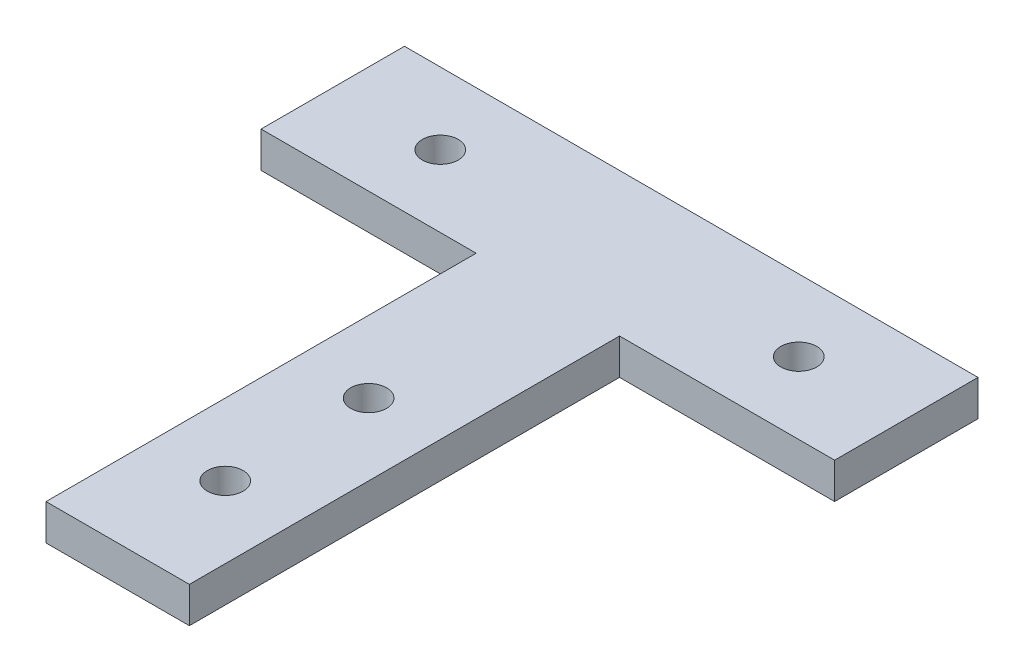
ISO-10303-21;
HEADER;
FILE_DESCRIPTION(('STEP AP214'),'2;1');
FILE_NAME('part.step','',(''),(''),'','','');
FILE_SCHEMA(('AUTOMOTIVE_DESIGN { 1 0 10303 214 1 1 1 1 }'));
ENDSEC;
DATA;
#1=APPLICATION_CONTEXT('core data for automotive mechanical design processes');
#2=APPLICATION_PROTOCOL_DEFINITION('international standard','automotive_design',2000,#1);
#3=PRODUCT_CONTEXT('',#1,'mechanical');
#4=PRODUCT('Part','Part','',(#3));
#5=PRODUCT_RELATED_PRODUCT_CATEGORY('part','',(#4));
#6=PRODUCT_DEFINITION_FORMATION('','',#4);
#7=PRODUCT_DEFINITION_CONTEXT('part definition',#1,'design');
#8=PRODUCT_DEFINITION('design','',#6,#7);
#9=PRODUCT_DEFINITION_SHAPE('','',#8);
#10=(LENGTH_UNIT() NAMED_UNIT(*) SI_UNIT(.MILLI.,.METRE.));
#11=(NAMED_UNIT(*) PLANE_ANGLE_UNIT() SI_UNIT($,.RADIAN.));
#12=(NAMED_UNIT(*) SI_UNIT($,.STERADIAN.) SOLID_ANGLE_UNIT());
#13=UNCERTAINTY_MEASURE_WITH_UNIT(LENGTH_MEASURE(1.E-05),#10,'distance_accuracy_value','');
#14=(GEOMETRIC_REPRESENTATION_CONTEXT(3) GLOBAL_UNCERTAINTY_ASSIGNED_CONTEXT((#13)) GLOBAL_UNIT_ASSIGNED_CONTEXT((#10,
#11,#12)) REPRESENTATION_CONTEXT('',''));
#15=CARTESIAN_POINT('',(0.,0.,0.));
#16=DIRECTION('',(0.,0.,1.));
#17=DIRECTION('',(1.,0.,0.));
#18=AXIS2_PLACEMENT_3D('',#15,#16,#17);
#19=CARTESIAN_POINT('',(0.,5.,0.));
#20=DIRECTION('',(0.,1.,0.));
#21=DIRECTION('',(0.,0.,1.));
#22=AXIS2_PLACEMENT_3D('',#19,#20,#21);
#23=PLANE('',#22);
#24=CARTESIAN_POINT('',(7.27272727272726,5.,59.1414141414141));
#25=DIRECTION('',(0.,1.,0.));
#26=DIRECTION('',(0.,0.,1.));
#27=AXIS2_PLACEMENT_3D('',#24,#25,#26);
#28=CIRCLE('',#27,2.5);
#29=CARTESIAN_POINT('',(7.27272727272726,5.,61.6414141414141));
#30=VERTEX_POINT('',#29);
#31=EDGE_CURVE('E188',#30,#30,#28,.T.);
#32=ORIENTED_EDGE('',*,*,#31,.F.);
#33=EDGE_LOOP('',(#32));
#34=FACE_BOUND('',#33,.T.);
#35=CARTESIAN_POINT('',(-17.7272727272727,5.,4.14141414141414));
#36=DIRECTION('',(0.,1.,0.));
#37=DIRECTION('',(0.,0.,1.));
#38=AXIS2_PLACEMENT_3D('',#35,#36,#37);
#39=CIRCLE('',#38,2.5);
#40=CARTESIAN_POINT('',(-17.7272727272727,5.,6.64141414141414));
#41=VERTEX_POINT('',#40);
#42=EDGE_CURVE('E134',#41,#41,#39,.T.);
#43=ORIENTED_EDGE('',*,*,#42,.F.);
#44=EDGE_LOOP('',(#43));
#45=FACE_BOUND('',#44,.T.);
#46=DIRECTION('',(0.,0.,1.));
#47=VECTOR('',#46,1.);
#48=CARTESIAN_POINT('',(-32.7272727272727,5.,-5.85858585858586));
#49=LINE('',#48,#47);
#50=CARTESIAN_POINT('',(-32.7272727272727,5.,-5.85858585858586));
#51=VERTEX_POINT('',#50);
#52=CARTESIAN_POINT('',(-32.7272727272727,5.,14.1414141414141));
#53=VERTEX_POINT('',#52);
#54=EDGE_CURVE('E145',#51,#53,#49,.T.);
#55=ORIENTED_EDGE('',*,*,#54,.T.);
#56=DIRECTION('',(1.,0.,0.));
#57=VECTOR('',#56,1.);
#58=CARTESIAN_POINT('',(-32.7272727272727,5.,14.1414141414141));
#59=LINE('',#58,#57);
#60=CARTESIAN_POINT('',(-2.72727272727274,5.,14.1414141414141));
#61=VERTEX_POINT('',#60);
#62=EDGE_CURVE('E93',#53,#61,#59,.T.);
#63=ORIENTED_EDGE('',*,*,#62,.T.);
#64=DIRECTION('',(0.,0.,1.));
#65=VECTOR('',#64,1.);
#66=CARTESIAN_POINT('',(-2.72727272727274,5.,14.1414141414141));
#67=LINE('',#66,#65);
#68=CARTESIAN_POINT('',(-2.72727272727272,5.,74.1414141414141));
#69=VERTEX_POINT('',#68);
#70=EDGE_CURVE('E160',#61,#69,#67,.T.);
#71=ORIENTED_EDGE('',*,*,#70,.T.);
#72=DIRECTION('',(1.,0.,0.));
#73=VECTOR('',#72,1.);
#74=CARTESIAN_POINT('',(-2.72727272727272,5.,74.1414141414141));
#75=LINE('',#74,#73);
#76=CARTESIAN_POINT('',(17.2727272727273,5.,74.1414141414141));
#77=VERTEX_POINT('',#76);
#78=EDGE_CURVE('E173',#69,#77,#75,.T.);
#79=ORIENTED_EDGE('',*,*,#78,.T.);
#80=DIRECTION('',(0.,0.,-1.));
#81=VECTOR('',#80,1.);
#82=CARTESIAN_POINT('',(17.2727272727273,5.,14.1414141414141));
#83=LINE('',#82,#81);
#84=CARTESIAN_POINT('',(17.2727272727273,5.,14.1414141414141));
#85=VERTEX_POINT('',#84);
#86=EDGE_CURVE('E112',#77,#85,#83,.T.);
#87=ORIENTED_EDGE('',*,*,#86,.T.);
#88=DIRECTION('',(1.,0.,0.));
#89=VECTOR('',#88,1.);
#90=CARTESIAN_POINT('',(17.2727272727273,5.,14.1414141414141));
#91=LINE('',#90,#89);
#92=CARTESIAN_POINT('',(47.2727272727273,5.,14.1414141414141));
#93=VERTEX_POINT('',#92);
#94=EDGE_CURVE('E106',#85,#93,#91,.T.);
#95=ORIENTED_EDGE('',*,*,#94,.T.);
#96=DIRECTION('',(0.,0.,-1.));
#97=VECTOR('',#96,1.);
#98=CARTESIAN_POINT('',(47.2727272727273,5.,-5.85858585858586));
#99=LINE('',#98,#97);
#100=CARTESIAN_POINT('',(47.2727272727273,5.,-5.85858585858586));
#101=VERTEX_POINT('',#100);
#102=EDGE_CURVE('E110',#93,#101,#99,.T.);
#103=ORIENTED_EDGE('',*,*,#102,.T.);
#104=DIRECTION('',(-1.,0.,0.));
#105=VECTOR('',#104,1.);
#106=CARTESIAN_POINT('',(-32.7272727272727,5.,-5.85858585858586));
#107=LINE('',#106,#105);
#108=EDGE_CURVE('E50',#101,#51,#107,.T.);
#109=ORIENTED_EDGE('',*,*,#108,.T.);
#110=EDGE_LOOP('',(#55,#63,#71,#79,#87,#95,#103,#109));
#111=FACE_BOUND('',#110,.T.);
#112=CARTESIAN_POINT('',(7.27272727272726,5.,39.1414141414141));
#113=DIRECTION('',(0.,1.,0.));
#114=DIRECTION('',(0.,0.,1.));
#115=AXIS2_PLACEMENT_3D('',#112,#113,#114);
#116=CIRCLE('',#115,2.5);
#117=CARTESIAN_POINT('',(7.27272727272726,5.,41.6414141414141));
#118=VERTEX_POINT('',#117);
#119=EDGE_CURVE('E182',#118,#118,#116,.T.);
#120=ORIENTED_EDGE('',*,*,#119,.F.);
#121=EDGE_LOOP('',(#120));
#122=FACE_BOUND('',#121,.T.);
#123=CARTESIAN_POINT('',(32.2727272727273,5.,4.14141414141412));
#124=DIRECTION('',(0.,1.,0.));
#125=DIRECTION('',(0.,0.,-1.));
#126=AXIS2_PLACEMENT_3D('',#123,#124,#125);
#127=CIRCLE('',#126,2.5);
#128=CARTESIAN_POINT('',(32.2727272727273,5.,1.64141414141412));
#129=VERTEX_POINT('',#128);
#130=EDGE_CURVE('E194',#129,#129,#127,.T.);
#131=ORIENTED_EDGE('',*,*,#130,.F.);
#132=EDGE_LOOP('',(#131));
#133=FACE_BOUND('',#132,.T.);
#134=ADVANCED_FACE('F33',(#34,#45,#111,#122,#133),#23,.T.);
#135=CARTESIAN_POINT('',(0.,0.,0.));
#136=DIRECTION('',(0.,1.,0.));
#137=DIRECTION('',(0.,0.,1.));
#138=AXIS2_PLACEMENT_3D('',#135,#136,#137);
#139=PLANE('',#138);
#140=DIRECTION('',(0.,0.,1.));
#141=VECTOR('',#140,1.);
#142=CARTESIAN_POINT('',(-32.7272727272727,0.,-5.85858585858586));
#143=LINE('',#142,#141);
#144=CARTESIAN_POINT('',(-32.7272727272727,0.,-5.85858585858586));
#145=VERTEX_POINT('',#144);
#146=CARTESIAN_POINT('',(-32.7272727272727,0.,14.1414141414141));
#147=VERTEX_POINT('',#146);
#148=EDGE_CURVE('E130',#145,#147,#143,.T.);
#149=ORIENTED_EDGE('',*,*,#148,.F.);
#150=DIRECTION('',(-1.,0.,0.));
#151=VECTOR('',#150,1.);
#152=CARTESIAN_POINT('',(-32.7272727272727,0.,-5.85858585858586));
#153=LINE('',#152,#151);
#154=CARTESIAN_POINT('',(47.2727272727273,0.,-5.85858585858586));
#155=VERTEX_POINT('',#154);
#156=EDGE_CURVE('E85',#155,#145,#153,.T.);
#157=ORIENTED_EDGE('',*,*,#156,.F.);
#158=DIRECTION('',(0.,0.,-1.));
#159=VECTOR('',#158,1.);
#160=CARTESIAN_POINT('',(47.2727272727273,0.,-5.85858585858586));
#161=LINE('',#160,#159);
#162=CARTESIAN_POINT('',(47.2727272727273,0.,14.1414141414141));
#163=VERTEX_POINT('',#162);
#164=EDGE_CURVE('E79',#163,#155,#161,.T.);
#165=ORIENTED_EDGE('',*,*,#164,.F.);
#166=DIRECTION('',(1.,0.,0.));
#167=VECTOR('',#166,1.);
#168=CARTESIAN_POINT('',(17.2727272727273,0.,14.1414141414141));
#169=LINE('',#168,#167);
#170=CARTESIAN_POINT('',(17.2727272727273,0.,14.1414141414141));
#171=VERTEX_POINT('',#170);
#172=EDGE_CURVE('E120',#171,#163,#169,.T.);
#173=ORIENTED_EDGE('',*,*,#172,.F.);
#174=DIRECTION('',(0.,0.,-1.));
#175=VECTOR('',#174,1.);
#176=CARTESIAN_POINT('',(17.2727272727273,0.,14.1414141414141));
#177=LINE('',#176,#175);
#178=CARTESIAN_POINT('',(17.2727272727273,0.,74.1414141414141));
#179=VERTEX_POINT('',#178);
#180=EDGE_CURVE('E140',#179,#171,#177,.T.);
#181=ORIENTED_EDGE('',*,*,#180,.F.);
#182=DIRECTION('',(1.,0.,0.));
#183=VECTOR('',#182,1.);
#184=CARTESIAN_POINT('',(-2.72727272727272,0.,74.1414141414141));
#185=LINE('',#184,#183);
#186=CARTESIAN_POINT('',(-2.72727272727272,0.,74.1414141414141));
#187=VERTEX_POINT('',#186);
#188=EDGE_CURVE('E138',#187,#179,#185,.T.);
#189=ORIENTED_EDGE('',*,*,#188,.F.);
#190=DIRECTION('',(0.,0.,1.));
#191=VECTOR('',#190,1.);
#192=CARTESIAN_POINT('',(-2.72727272727274,0.,14.1414141414141));
#193=LINE('',#192,#191);
#194=CARTESIAN_POINT('',(-2.72727272727274,0.,14.1414141414141));
#195=VERTEX_POINT('',#194);
#196=EDGE_CURVE('E136',#195,#187,#193,.T.);
#197=ORIENTED_EDGE('',*,*,#196,.F.);
#198=DIRECTION('',(1.,0.,0.));
#199=VECTOR('',#198,1.);
#200=CARTESIAN_POINT('',(-32.7272727272727,0.,14.1414141414141));
#201=LINE('',#200,#199);
#202=EDGE_CURVE('E133',#147,#195,#201,.T.);
#203=ORIENTED_EDGE('',*,*,#202,.F.);
#204=EDGE_LOOP('',(#149,#157,#165,#173,#181,#189,#197,#203));
#205=FACE_BOUND('',#204,.T.);
#206=CARTESIAN_POINT('',(-17.7272727272727,0.,4.14141414141414));
#207=DIRECTION('',(0.,1.,0.));
#208=DIRECTION('',(0.,0.,1.));
#209=AXIS2_PLACEMENT_3D('',#206,#207,#208);
#210=CIRCLE('',#209,2.5);
#211=CARTESIAN_POINT('',(-17.7272727272727,0.,6.64141414141414));
#212=VERTEX_POINT('',#211);
#213=EDGE_CURVE('E179',#212,#212,#210,.T.);
#214=ORIENTED_EDGE('',*,*,#213,.T.);
#215=EDGE_LOOP('',(#214));
#216=FACE_BOUND('',#215,.T.);
#217=CARTESIAN_POINT('',(7.27272727272726,0.,39.1414141414141));
#218=DIRECTION('',(0.,1.,0.));
#219=DIRECTION('',(0.,0.,1.));
#220=AXIS2_PLACEMENT_3D('',#217,#218,#219);
#221=CIRCLE('',#220,2.5);
#222=CARTESIAN_POINT('',(7.27272727272726,0.,41.6414141414141));
#223=VERTEX_POINT('',#222);
#224=EDGE_CURVE('E185',#223,#223,#221,.T.);
#225=ORIENTED_EDGE('',*,*,#224,.T.);
#226=EDGE_LOOP('',(#225));
#227=FACE_BOUND('',#226,.T.);
#228=CARTESIAN_POINT('',(7.27272727272726,0.,59.1414141414141));
#229=DIRECTION('',(0.,1.,0.));
#230=DIRECTION('',(0.,0.,1.));
#231=AXIS2_PLACEMENT_3D('',#228,#229,#230);
#232=CIRCLE('',#231,2.5);
#233=CARTESIAN_POINT('',(7.27272727272726,0.,61.6414141414141));
#234=VERTEX_POINT('',#233);
#235=EDGE_CURVE('E191',#234,#234,#232,.T.);
#236=ORIENTED_EDGE('',*,*,#235,.T.);
#237=EDGE_LOOP('',(#236));
#238=FACE_BOUND('',#237,.T.);
#239=CARTESIAN_POINT('',(32.2727272727273,0.,4.14141414141412));
#240=DIRECTION('',(0.,1.,0.));
#241=DIRECTION('',(0.,0.,-1.));
#242=AXIS2_PLACEMENT_3D('',#239,#240,#241);
#243=CIRCLE('',#242,2.5);
#244=CARTESIAN_POINT('',(32.2727272727273,0.,1.64141414141412));
#245=VERTEX_POINT('',#244);
#246=EDGE_CURVE('E197',#245,#245,#243,.T.);
#247=ORIENTED_EDGE('',*,*,#246,.T.);
#248=EDGE_LOOP('',(#247));
#249=FACE_BOUND('',#248,.T.);
#250=ADVANCED_FACE('F164',(#205,#216,#227,#238,#249),#139,.F.);
#251=CARTESIAN_POINT('',(-32.7272727272727,5.,-5.85858585858586));
#252=DIRECTION('',(1.,0.,0.));
#253=DIRECTION('',(0.,0.,-1.));
#254=AXIS2_PLACEMENT_3D('',#251,#252,#253);
#255=PLANE('',#254);
#256=ORIENTED_EDGE('',*,*,#148,.T.);
#257=DIRECTION('',(0.,-1.,0.));
#258=VECTOR('',#257,1.);
#259=CARTESIAN_POINT('',(-32.7272727272727,5.,14.1414141414141));
#260=LINE('',#259,#258);
#261=EDGE_CURVE('E11',#53,#147,#260,.T.);
#262=ORIENTED_EDGE('',*,*,#261,.F.);
#263=ORIENTED_EDGE('',*,*,#54,.F.);
#264=DIRECTION('',(0.,-1.,0.));
#265=VECTOR('',#264,1.);
#266=CARTESIAN_POINT('',(-32.7272727272727,5.,-5.85858585858586));
#267=LINE('',#266,#265);
#268=EDGE_CURVE('E126',#51,#145,#267,.T.);
#269=ORIENTED_EDGE('',*,*,#268,.T.);
#270=EDGE_LOOP('',(#256,#262,#263,#269));
#271=FACE_BOUND('',#270,.T.);
#272=ADVANCED_FACE('F35',(#271),#255,.F.);
#273=CARTESIAN_POINT('',(-32.7272727272727,5.,14.1414141414141));
#274=DIRECTION('',(0.,0.,-1.));
#275=DIRECTION('',(-1.,0.,0.));
#276=AXIS2_PLACEMENT_3D('',#273,#274,#275);
#277=PLANE('',#276);
#278=ORIENTED_EDGE('',*,*,#202,.T.);
#279=DIRECTION('',(0.,-1.,0.));
#280=VECTOR('',#279,1.);
#281=CARTESIAN_POINT('',(-2.72727272727274,5.,14.1414141414141));
#282=LINE('',#281,#280);
#283=EDGE_CURVE('E42',#61,#195,#282,.T.);
#284=ORIENTED_EDGE('',*,*,#283,.F.);
#285=ORIENTED_EDGE('',*,*,#62,.F.);
#286=ORIENTED_EDGE('',*,*,#261,.T.);
#287=EDGE_LOOP('',(#278,#284,#285,#286));
#288=FACE_BOUND('',#287,.T.);
#289=ADVANCED_FACE('F231',(#288),#277,.F.);
#290=CARTESIAN_POINT('',(-2.72727272727274,5.,14.1414141414141));
#291=DIRECTION('',(1.,0.,0.));
#292=DIRECTION('',(0.,0.,-1.));
#293=AXIS2_PLACEMENT_3D('',#290,#291,#292);
#294=PLANE('',#293);
#295=ORIENTED_EDGE('',*,*,#196,.T.);
#296=DIRECTION('',(0.,-1.,0.));
#297=VECTOR('',#296,1.);
#298=CARTESIAN_POINT('',(-2.72727272727272,5.,74.1414141414141));
#299=LINE('',#298,#297);
#300=EDGE_CURVE('E152',#69,#187,#299,.T.);
#301=ORIENTED_EDGE('',*,*,#300,.F.);
#302=ORIENTED_EDGE('',*,*,#70,.F.);
#303=ORIENTED_EDGE('',*,*,#283,.T.);
#304=EDGE_LOOP('',(#295,#301,#302,#303));
#305=FACE_BOUND('',#304,.T.);
#306=ADVANCED_FACE('F158',(#305),#294,.F.);
#307=CARTESIAN_POINT('',(-2.72727272727272,5.,74.1414141414141));
#308=DIRECTION('',(0.,0.,-1.));
#309=DIRECTION('',(-1.,0.,0.));
#310=AXIS2_PLACEMENT_3D('',#307,#308,#309);
#311=PLANE('',#310);
#312=ORIENTED_EDGE('',*,*,#188,.T.);
#313=DIRECTION('',(0.,-1.,0.));
#314=VECTOR('',#313,1.);
#315=CARTESIAN_POINT('',(17.2727272727273,5.,74.1414141414141));
#316=LINE('',#315,#314);
#317=EDGE_CURVE('E149',#77,#179,#316,.T.);
#318=ORIENTED_EDGE('',*,*,#317,.F.);
#319=ORIENTED_EDGE('',*,*,#78,.F.);
#320=ORIENTED_EDGE('',*,*,#300,.T.);
#321=EDGE_LOOP('',(#312,#318,#319,#320));
#322=FACE_BOUND('',#321,.T.);
#323=ADVANCED_FACE('F169',(#322),#311,.F.);
#324=CARTESIAN_POINT('',(17.2727272727273,5.,14.1414141414141));
#325=DIRECTION('',(-1.,0.,0.));
#326=DIRECTION('',(0.,0.,1.));
#327=AXIS2_PLACEMENT_3D('',#324,#325,#326);
#328=PLANE('',#327);
#329=ORIENTED_EDGE('',*,*,#180,.T.);
#330=DIRECTION('',(0.,-1.,0.));
#331=VECTOR('',#330,1.);
#332=CARTESIAN_POINT('',(17.2727272727273,5.,14.1414141414141));
#333=LINE('',#332,#331);
#334=EDGE_CURVE('E121',#85,#171,#333,.T.);
#335=ORIENTED_EDGE('',*,*,#334,.F.);
#336=ORIENTED_EDGE('',*,*,#86,.F.);
#337=ORIENTED_EDGE('',*,*,#317,.T.);
#338=EDGE_LOOP('',(#329,#335,#336,#337));
#339=FACE_BOUND('',#338,.T.);
#340=ADVANCED_FACE('F172',(#339),#328,.F.);
#341=CARTESIAN_POINT('',(17.2727272727273,5.,14.1414141414141));
#342=DIRECTION('',(0.,0.,-1.));
#343=DIRECTION('',(-1.,0.,0.));
#344=AXIS2_PLACEMENT_3D('',#341,#342,#343);
#345=PLANE('',#344);
#346=ORIENTED_EDGE('',*,*,#172,.T.);
#347=DIRECTION('',(0.,-1.,0.));
#348=VECTOR('',#347,1.);
#349=CARTESIAN_POINT('',(47.2727272727273,5.,14.1414141414141));
#350=LINE('',#349,#348);
#351=EDGE_CURVE('E117',#93,#163,#350,.T.);
#352=ORIENTED_EDGE('',*,*,#351,.F.);
#353=ORIENTED_EDGE('',*,*,#94,.F.);
#354=ORIENTED_EDGE('',*,*,#334,.T.);
#355=EDGE_LOOP('',(#346,#352,#353,#354));
#356=FACE_BOUND('',#355,.T.);
#357=ADVANCED_FACE('F118',(#356),#345,.F.);
#358=CARTESIAN_POINT('',(47.2727272727273,5.,-5.85858585858586));
#359=DIRECTION('',(-1.,0.,0.));
#360=DIRECTION('',(0.,0.,1.));
#361=AXIS2_PLACEMENT_3D('',#358,#359,#360);
#362=PLANE('',#361);
#363=ORIENTED_EDGE('',*,*,#164,.T.);
#364=DIRECTION('',(0.,-1.,0.));
#365=VECTOR('',#364,1.);
#366=CARTESIAN_POINT('',(47.2727272727273,5.,-5.85858585858586));
#367=LINE('',#366,#365);
#368=EDGE_CURVE('E122',#101,#155,#367,.T.);
#369=ORIENTED_EDGE('',*,*,#368,.F.);
#370=ORIENTED_EDGE('',*,*,#102,.F.);
#371=ORIENTED_EDGE('',*,*,#351,.T.);
#372=EDGE_LOOP('',(#363,#369,#370,#371));
#373=FACE_BOUND('',#372,.T.);
#374=ADVANCED_FACE('F124',(#373),#362,.F.);
#375=CARTESIAN_POINT('',(-32.7272727272727,5.,-5.85858585858586));
#376=DIRECTION('',(0.,0.,1.));
#377=DIRECTION('',(1.,0.,0.));
#378=AXIS2_PLACEMENT_3D('',#375,#376,#377);
#379=PLANE('',#378);
#380=ORIENTED_EDGE('',*,*,#156,.T.);
#381=ORIENTED_EDGE('',*,*,#268,.F.);
#382=ORIENTED_EDGE('',*,*,#108,.F.);
#383=ORIENTED_EDGE('',*,*,#368,.T.);
#384=EDGE_LOOP('',(#380,#381,#382,#383));
#385=FACE_BOUND('',#384,.T.);
#386=ADVANCED_FACE('F219',(#385),#379,.F.);
#387=CARTESIAN_POINT('',(-17.7272727272727,5.,4.14141414141414));
#388=DIRECTION('',(0.,-1.,0.));
#389=DIRECTION('',(0.,0.,-1.));
#390=AXIS2_PLACEMENT_3D('',#387,#388,#389);
#391=CYLINDRICAL_SURFACE('',#390,2.5);
#392=ORIENTED_EDGE('',*,*,#42,.T.);
#393=EDGE_LOOP('',(#392));
#394=FACE_BOUND('',#393,.T.);
#395=ORIENTED_EDGE('',*,*,#213,.F.);
#396=EDGE_LOOP('',(#395));
#397=FACE_BOUND('',#396,.T.);
#398=ADVANCED_FACE('F216',(#394,#397),#391,.F.);
#399=CARTESIAN_POINT('',(7.27272727272726,5.,39.1414141414141));
#400=DIRECTION('',(0.,-1.,0.));
#401=DIRECTION('',(0.,0.,-1.));
#402=AXIS2_PLACEMENT_3D('',#399,#400,#401);
#403=CYLINDRICAL_SURFACE('',#402,2.5);
#404=ORIENTED_EDGE('',*,*,#119,.T.);
#405=EDGE_LOOP('',(#404));
#406=FACE_BOUND('',#405,.T.);
#407=ORIENTED_EDGE('',*,*,#224,.F.);
#408=EDGE_LOOP('',(#407));
#409=FACE_BOUND('',#408,.T.);
#410=ADVANCED_FACE('F295',(#406,#409),#403,.F.);
#411=CARTESIAN_POINT('',(7.27272727272726,5.,59.1414141414141));
#412=DIRECTION('',(0.,-1.,0.));
#413=DIRECTION('',(0.,0.,-1.));
#414=AXIS2_PLACEMENT_3D('',#411,#412,#413);
#415=CYLINDRICAL_SURFACE('',#414,2.5);
#416=ORIENTED_EDGE('',*,*,#31,.T.);
#417=EDGE_LOOP('',(#416));
#418=FACE_BOUND('',#417,.T.);
#419=ORIENTED_EDGE('',*,*,#235,.F.);
#420=EDGE_LOOP('',(#419));
#421=FACE_BOUND('',#420,.T.);
#422=ADVANCED_FACE('F303',(#418,#421),#415,.F.);
#423=CARTESIAN_POINT('',(32.2727272727273,5.,4.14141414141412));
#424=DIRECTION('',(0.,-1.,0.));
#425=DIRECTION('',(0.,0.,-1.));
#426=AXIS2_PLACEMENT_3D('',#423,#424,#425);
#427=CYLINDRICAL_SURFACE('',#426,2.5);
#428=ORIENTED_EDGE('',*,*,#130,.T.);
#429=EDGE_LOOP('',(#428));
#430=FACE_BOUND('',#429,.T.);
#431=ORIENTED_EDGE('',*,*,#246,.F.);
#432=EDGE_LOOP('',(#431));
#433=FACE_BOUND('',#432,.T.);
#434=ADVANCED_FACE('F203',(#430,#433),#427,.F.);
#435=CLOSED_SHELL('',(#134,#250,#272,#289,#306,#323,#340,#357,#374,#386,#398,#410,#422,#434));
#436=MANIFOLD_SOLID_BREP('B2',#435);
#437=ADVANCED_BREP_SHAPE_REPRESENTATION('',(#18,#436),#14);
#438=SHAPE_DEFINITION_REPRESENTATION(#9,#437);
ENDSEC;
END-ISO-10303-21;
